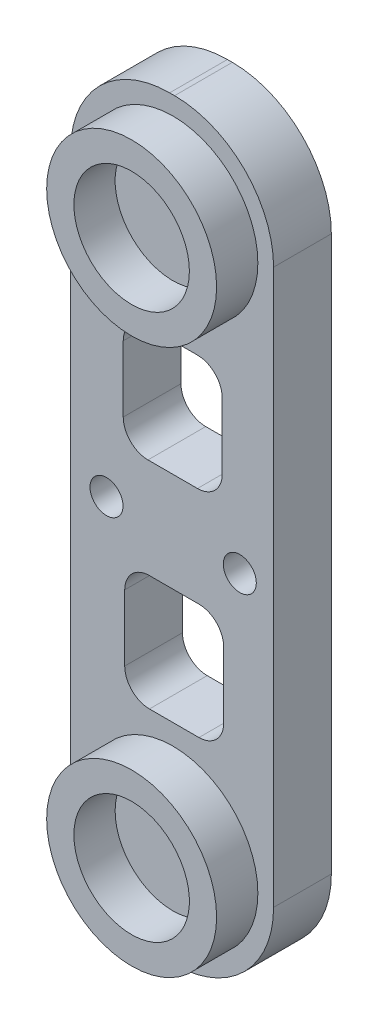
ISO-10303-21;
HEADER;
FILE_DESCRIPTION(('STEP AP214'),'2;1');
FILE_NAME('part.step','',(''),(''),'','','');
FILE_SCHEMA(('AUTOMOTIVE_DESIGN { 1 0 10303 214 1 1 1 1 }'));
ENDSEC;
DATA;
#1=APPLICATION_CONTEXT('core data for automotive mechanical design processes');
#2=APPLICATION_PROTOCOL_DEFINITION('international standard','automotive_design',2000,#1);
#3=PRODUCT_CONTEXT('',#1,'mechanical');
#4=PRODUCT('Part','Part','',(#3));
#5=PRODUCT_RELATED_PRODUCT_CATEGORY('part','',(#4));
#6=PRODUCT_DEFINITION_FORMATION('','',#4);
#7=PRODUCT_DEFINITION_CONTEXT('part definition',#1,'design');
#8=PRODUCT_DEFINITION('design','',#6,#7);
#9=PRODUCT_DEFINITION_SHAPE('','',#8);
#10=(LENGTH_UNIT() NAMED_UNIT(*) SI_UNIT(.MILLI.,.METRE.));
#11=(NAMED_UNIT(*) PLANE_ANGLE_UNIT() SI_UNIT($,.RADIAN.));
#12=(NAMED_UNIT(*) SI_UNIT($,.STERADIAN.) SOLID_ANGLE_UNIT());
#13=UNCERTAINTY_MEASURE_WITH_UNIT(LENGTH_MEASURE(1.E-05),#10,'distance_accuracy_value','');
#14=(GEOMETRIC_REPRESENTATION_CONTEXT(3) GLOBAL_UNCERTAINTY_ASSIGNED_CONTEXT((#13)) GLOBAL_UNIT_ASSIGNED_CONTEXT((#10,
#11,#12)) REPRESENTATION_CONTEXT('',''));
#15=CARTESIAN_POINT('',(0.,0.,0.));
#16=DIRECTION('',(0.,0.,1.));
#17=DIRECTION('',(1.,0.,0.));
#18=AXIS2_PLACEMENT_3D('',#15,#16,#17);
#19=CARTESIAN_POINT('',(0.,0.,13.5));
#20=DIRECTION('',(0.,0.,1.));
#21=DIRECTION('',(1.,0.,0.));
#22=AXIS2_PLACEMENT_3D('',#19,#20,#21);
#23=PLANE('',#22);
#24=CARTESIAN_POINT('',(-295.031286371623,300.589255580996,13.5));
#25=DIRECTION('',(0.,0.,1.));
#26=DIRECTION('',(-1.,0.,0.));
#27=AXIS2_PLACEMENT_3D('',#24,#25,#26);
#28=CIRCLE('',#27,5.15000000000001);
#29=CARTESIAN_POINT('',(-300.181286371623,300.589255580996,13.5));
#30=VERTEX_POINT('',#29);
#31=EDGE_CURVE('E673',#30,#30,#28,.T.);
#32=ORIENTED_EDGE('',*,*,#31,.F.);
#33=EDGE_LOOP('',(#32));
#34=FACE_BOUND('',#33,.T.);
#35=CARTESIAN_POINT('',(-295.031286371623,333.661108149607,13.5));
#36=DIRECTION('',(0.,0.,1.));
#37=DIRECTION('',(1.,0.,0.));
#38=AXIS2_PLACEMENT_3D('',#35,#36,#37);
#39=CIRCLE('',#38,5.15000000000001);
#40=CARTESIAN_POINT('',(-289.881286371623,333.661108149607,13.5));
#41=VERTEX_POINT('',#40);
#42=EDGE_CURVE('E661',#41,#41,#39,.T.);
#43=ORIENTED_EDGE('',*,*,#42,.F.);
#44=EDGE_LOOP('',(#43));
#45=FACE_BOUND('',#44,.T.);
#46=CARTESIAN_POINT('',(-290.975313949645,316.822329318234,13.5));
#47=DIRECTION('',(0.,0.,1.));
#48=DIRECTION('',(1.,0.,0.));
#49=AXIS2_PLACEMENT_3D('',#46,#47,#48);
#50=CIRCLE('',#49,0.999999999999998);
#51=CARTESIAN_POINT('',(-289.975313949645,316.822329318234,13.5));
#52=VERTEX_POINT('',#51);
#53=EDGE_CURVE('E480',#52,#52,#50,.T.);
#54=ORIENTED_EDGE('',*,*,#53,.F.);
#55=EDGE_LOOP('',(#54));
#56=FACE_BOUND('',#55,.T.);
#57=DIRECTION('',(0.,1.,0.));
#58=VECTOR('',#57,1.);
#59=CARTESIAN_POINT('',(-288.927990013679,339.925181865302,13.5));
#60=LINE('',#59,#58);
#61=CARTESIAN_POINT('',(-288.927990013679,300.325181865302,13.5));
#62=VERTEX_POINT('',#61);
#63=CARTESIAN_POINT('',(-288.927990013679,333.925181865302,13.5));
#64=VERTEX_POINT('',#63);
#65=EDGE_CURVE('E499',#62,#64,#60,.T.);
#66=ORIENTED_EDGE('',*,*,#65,.T.);
#67=CARTESIAN_POINT('',(-294.927990013679,333.925181865302,13.5));
#68=DIRECTION('',(0.,0.,1.));
#69=DIRECTION('',(1.,0.,0.));
#70=AXIS2_PLACEMENT_3D('',#67,#68,#69);
#71=CIRCLE('',#70,6.);
#72=CARTESIAN_POINT('',(-294.927990013679,339.925181865302,13.5));
#73=VERTEX_POINT('',#72);
#74=EDGE_CURVE('E268',#64,#73,#71,.T.);
#75=ORIENTED_EDGE('',*,*,#74,.T.);
#76=DIRECTION('',(-1.,0.,0.));
#77=VECTOR('',#76,1.);
#78=CARTESIAN_POINT('',(-301.227990013679,339.925181865302,13.5));
#79=LINE('',#78,#77);
#80=CARTESIAN_POINT('',(-295.227990013679,339.925181865302,13.5));
#81=VERTEX_POINT('',#80);
#82=EDGE_CURVE('E224',#73,#81,#79,.T.);
#83=ORIENTED_EDGE('',*,*,#82,.T.);
#84=CARTESIAN_POINT('',(-295.227990013679,333.925181865302,13.5));
#85=DIRECTION('',(0.,0.,1.));
#86=DIRECTION('',(1.,0.,0.));
#87=AXIS2_PLACEMENT_3D('',#84,#85,#86);
#88=CIRCLE('',#87,6.);
#89=CARTESIAN_POINT('',(-301.227990013679,333.925181865302,13.5));
#90=VERTEX_POINT('',#89);
#91=EDGE_CURVE('E265',#81,#90,#88,.T.);
#92=ORIENTED_EDGE('',*,*,#91,.T.);
#93=DIRECTION('',(0.,-1.,0.));
#94=VECTOR('',#93,1.);
#95=CARTESIAN_POINT('',(-301.227990013679,339.925181865302,13.5));
#96=LINE('',#95,#94);
#97=CARTESIAN_POINT('',(-301.227990013679,300.325181865302,13.5));
#98=VERTEX_POINT('',#97);
#99=EDGE_CURVE('E233',#90,#98,#96,.T.);
#100=ORIENTED_EDGE('',*,*,#99,.T.);
#101=CARTESIAN_POINT('',(-295.227990013679,300.325181865302,13.5));
#102=DIRECTION('',(0.,0.,1.));
#103=DIRECTION('',(1.,0.,0.));
#104=AXIS2_PLACEMENT_3D('',#101,#102,#103);
#105=CIRCLE('',#104,6.);
#106=CARTESIAN_POINT('',(-295.227990013679,294.325181865302,13.5));
#107=VERTEX_POINT('',#106);
#108=EDGE_CURVE('E259',#98,#107,#105,.T.);
#109=ORIENTED_EDGE('',*,*,#108,.T.);
#110=DIRECTION('',(1.,0.,0.));
#111=VECTOR('',#110,1.);
#112=CARTESIAN_POINT('',(-301.227990013679,294.325181865302,13.5));
#113=LINE('',#112,#111);
#114=CARTESIAN_POINT('',(-294.927990013679,294.325181865302,13.5));
#115=VERTEX_POINT('',#114);
#116=EDGE_CURVE('E239',#107,#115,#113,.T.);
#117=ORIENTED_EDGE('',*,*,#116,.T.);
#118=CARTESIAN_POINT('',(-294.927990013679,300.325181865302,13.5));
#119=DIRECTION('',(0.,0.,1.));
#120=DIRECTION('',(1.,0.,0.));
#121=AXIS2_PLACEMENT_3D('',#118,#119,#120);
#122=CIRCLE('',#121,6.);
#123=EDGE_CURVE('E262',#115,#62,#122,.T.);
#124=ORIENTED_EDGE('',*,*,#123,.T.);
#125=EDGE_LOOP('',(#66,#75,#83,#92,#100,#109,#117,#124));
#126=FACE_BOUND('',#125,.T.);
#127=CARTESIAN_POINT('',(-299.05350465197,316.822329318234,13.5));
#128=DIRECTION('',(0.,0.,1.));
#129=DIRECTION('',(1.,0.,0.));
#130=AXIS2_PLACEMENT_3D('',#127,#128,#129);
#131=CIRCLE('',#130,0.999999999999998);
#132=CARTESIAN_POINT('',(-298.05350465197,316.822329318234,13.5));
#133=VERTEX_POINT('',#132);
#134=EDGE_CURVE('E485',#133,#133,#131,.T.);
#135=ORIENTED_EDGE('',*,*,#134,.F.);
#136=EDGE_LOOP('',(#135));
#137=FACE_BOUND('',#136,.T.);
#138=DIRECTION('',(-1.,0.,0.));
#139=VECTOR('',#138,1.);
#140=CARTESIAN_POINT('',(-291.95137434347,313.976860406476,13.5));
#141=LINE('',#140,#139);
#142=CARTESIAN_POINT('',(-293.45137434347,313.976860406476,13.5));
#143=VERTEX_POINT('',#142);
#144=CARTESIAN_POINT('',(-296.451374343471,313.976860406476,13.5));
#145=VERTEX_POINT('',#144);
#146=EDGE_CURVE('E621',#143,#145,#141,.T.);
#147=ORIENTED_EDGE('',*,*,#146,.F.);
#148=CARTESIAN_POINT('',(-293.45137434347,312.476860406476,13.5));
#149=DIRECTION('',(0.,0.,1.));
#150=DIRECTION('',(1.,0.,0.));
#151=AXIS2_PLACEMENT_3D('',#148,#149,#150);
#152=CIRCLE('',#151,1.5);
#153=CARTESIAN_POINT('',(-291.95137434347,312.476860406476,13.5));
#154=VERTEX_POINT('',#153);
#155=EDGE_CURVE('E355',#143,#154,#152,.F.);
#156=ORIENTED_EDGE('',*,*,#155,.T.);
#157=DIRECTION('',(0.,1.,0.));
#158=VECTOR('',#157,1.);
#159=CARTESIAN_POINT('',(-291.95137434347,306.976860406476,13.5));
#160=LINE('',#159,#158);
#161=CARTESIAN_POINT('',(-291.95137434347,308.476860406476,13.5));
#162=VERTEX_POINT('',#161);
#163=EDGE_CURVE('E617',#162,#154,#160,.T.);
#164=ORIENTED_EDGE('',*,*,#163,.F.);
#165=CARTESIAN_POINT('',(-293.45137434347,308.476860406476,13.5));
#166=DIRECTION('',(0.,0.,1.));
#167=DIRECTION('',(1.,0.,0.));
#168=AXIS2_PLACEMENT_3D('',#165,#166,#167);
#169=CIRCLE('',#168,1.5);
#170=CARTESIAN_POINT('',(-293.45137434347,306.976860406476,13.5));
#171=VERTEX_POINT('',#170);
#172=EDGE_CURVE('E349',#162,#171,#169,.F.);
#173=ORIENTED_EDGE('',*,*,#172,.T.);
#174=DIRECTION('',(1.,0.,0.));
#175=VECTOR('',#174,1.);
#176=CARTESIAN_POINT('',(-291.95137434347,306.976860406476,13.5));
#177=LINE('',#176,#175);
#178=CARTESIAN_POINT('',(-296.451374343471,306.976860406476,13.5));
#179=VERTEX_POINT('',#178);
#180=EDGE_CURVE('E630',#179,#171,#177,.T.);
#181=ORIENTED_EDGE('',*,*,#180,.F.);
#182=CARTESIAN_POINT('',(-296.451374343471,308.476860406476,13.5));
#183=DIRECTION('',(0.,0.,1.));
#184=DIRECTION('',(1.,0.,0.));
#185=AXIS2_PLACEMENT_3D('',#182,#183,#184);
#186=CIRCLE('',#185,1.5);
#187=CARTESIAN_POINT('',(-297.951374343471,308.476860406476,13.5));
#188=VERTEX_POINT('',#187);
#189=EDGE_CURVE('E343',#179,#188,#186,.F.);
#190=ORIENTED_EDGE('',*,*,#189,.T.);
#191=DIRECTION('',(0.,-1.,0.));
#192=VECTOR('',#191,1.);
#193=CARTESIAN_POINT('',(-297.951374343471,306.976860406476,13.5));
#194=LINE('',#193,#192);
#195=CARTESIAN_POINT('',(-297.951374343471,312.476860406476,13.5));
#196=VERTEX_POINT('',#195);
#197=EDGE_CURVE('E626',#196,#188,#194,.T.);
#198=ORIENTED_EDGE('',*,*,#197,.F.);
#199=CARTESIAN_POINT('',(-296.451374343471,312.476860406476,13.5));
#200=DIRECTION('',(0.,0.,1.));
#201=DIRECTION('',(1.,0.,0.));
#202=AXIS2_PLACEMENT_3D('',#199,#200,#201);
#203=CIRCLE('',#202,1.5);
#204=EDGE_CURVE('E361',#196,#145,#203,.F.);
#205=ORIENTED_EDGE('',*,*,#204,.T.);
#206=EDGE_LOOP('',(#147,#156,#164,#173,#181,#190,#198,#205));
#207=FACE_BOUND('',#206,.T.);
#208=DIRECTION('',(-1.,0.,0.));
#209=VECTOR('',#208,1.);
#210=CARTESIAN_POINT('',(-292.040754441965,327.002825528129,13.5));
#211=LINE('',#210,#209);
#212=CARTESIAN_POINT('',(-293.540754441965,327.002825528129,13.5));
#213=VERTEX_POINT('',#212);
#214=CARTESIAN_POINT('',(-296.540754441965,327.002825528129,13.5));
#215=VERTEX_POINT('',#214);
#216=EDGE_CURVE('E590',#213,#215,#211,.T.);
#217=ORIENTED_EDGE('',*,*,#216,.F.);
#218=CARTESIAN_POINT('',(-293.540754441965,325.502825528129,13.5));
#219=DIRECTION('',(0.,0.,1.));
#220=DIRECTION('',(1.,0.,0.));
#221=AXIS2_PLACEMENT_3D('',#218,#219,#220);
#222=CIRCLE('',#221,1.5);
#223=CARTESIAN_POINT('',(-292.040754441965,325.502825528129,13.5));
#224=VERTEX_POINT('',#223);
#225=EDGE_CURVE('E55',#213,#224,#222,.F.);
#226=ORIENTED_EDGE('',*,*,#225,.T.);
#227=DIRECTION('',(0.,1.,0.));
#228=VECTOR('',#227,1.);
#229=CARTESIAN_POINT('',(-292.040754441965,320.002825528129,13.5));
#230=LINE('',#229,#228);
#231=CARTESIAN_POINT('',(-292.040754441965,321.502825528129,13.5));
#232=VERTEX_POINT('',#231);
#233=EDGE_CURVE('E597',#232,#224,#230,.T.);
#234=ORIENTED_EDGE('',*,*,#233,.F.);
#235=CARTESIAN_POINT('',(-293.540754441965,321.502825528129,13.5));
#236=DIRECTION('',(0.,0.,1.));
#237=DIRECTION('',(1.,0.,0.));
#238=AXIS2_PLACEMENT_3D('',#235,#236,#237);
#239=CIRCLE('',#238,1.5);
#240=CARTESIAN_POINT('',(-293.540754441965,320.002825528129,13.5));
#241=VERTEX_POINT('',#240);
#242=EDGE_CURVE('E373',#232,#241,#239,.F.);
#243=ORIENTED_EDGE('',*,*,#242,.T.);
#244=DIRECTION('',(1.,0.,0.));
#245=VECTOR('',#244,1.);
#246=CARTESIAN_POINT('',(-292.040754441965,320.002825528129,13.5));
#247=LINE('',#246,#245);
#248=CARTESIAN_POINT('',(-296.540754441965,320.002825528129,13.5));
#249=VERTEX_POINT('',#248);
#250=EDGE_CURVE('E585',#249,#241,#247,.T.);
#251=ORIENTED_EDGE('',*,*,#250,.F.);
#252=CARTESIAN_POINT('',(-296.540754441965,321.502825528129,13.5));
#253=DIRECTION('',(0.,0.,1.));
#254=DIRECTION('',(1.,0.,0.));
#255=AXIS2_PLACEMENT_3D('',#252,#253,#254);
#256=CIRCLE('',#255,1.5);
#257=CARTESIAN_POINT('',(-298.040754441965,321.502825528129,13.5));
#258=VERTEX_POINT('',#257);
#259=EDGE_CURVE('E379',#249,#258,#256,.F.);
#260=ORIENTED_EDGE('',*,*,#259,.T.);
#261=DIRECTION('',(0.,-1.,0.));
#262=VECTOR('',#261,1.);
#263=CARTESIAN_POINT('',(-298.040754441965,320.002825528129,13.5));
#264=LINE('',#263,#262);
#265=CARTESIAN_POINT('',(-298.040754441965,325.502825528129,13.5));
#266=VERTEX_POINT('',#265);
#267=EDGE_CURVE('E582',#266,#258,#264,.T.);
#268=ORIENTED_EDGE('',*,*,#267,.F.);
#269=CARTESIAN_POINT('',(-296.540754441965,325.502825528129,13.5));
#270=DIRECTION('',(0.,0.,1.));
#271=DIRECTION('',(1.,0.,0.));
#272=AXIS2_PLACEMENT_3D('',#269,#270,#271);
#273=CIRCLE('',#272,1.5);
#274=EDGE_CURVE('E367',#266,#215,#273,.F.);
#275=ORIENTED_EDGE('',*,*,#274,.T.);
#276=EDGE_LOOP('',(#217,#226,#234,#243,#251,#260,#268,#275));
#277=FACE_BOUND('',#276,.T.);
#278=ADVANCED_FACE('F39',(#34,#45,#56,#126,#137,#207,#277),#23,.T.);
#279=CARTESIAN_POINT('',(0.,0.,10.));
#280=DIRECTION('',(0.,0.,1.));
#281=DIRECTION('',(1.,0.,0.));
#282=AXIS2_PLACEMENT_3D('',#279,#280,#281);
#283=PLANE('',#282);
#284=DIRECTION('',(1.,0.,0.));
#285=VECTOR('',#284,1.);
#286=CARTESIAN_POINT('',(-291.95137434347,306.976860406476,10.));
#287=LINE('',#286,#285);
#288=CARTESIAN_POINT('',(-296.451374343471,306.976860406476,10.));
#289=VERTEX_POINT('',#288);
#290=CARTESIAN_POINT('',(-293.45137434347,306.976860406476,10.));
#291=VERTEX_POINT('',#290);
#292=EDGE_CURVE('E622',#289,#291,#287,.T.);
#293=ORIENTED_EDGE('',*,*,#292,.T.);
#294=CARTESIAN_POINT('',(-293.45137434347,308.476860406476,10.));
#295=DIRECTION('',(0.,0.,1.));
#296=DIRECTION('',(1.,0.,0.));
#297=AXIS2_PLACEMENT_3D('',#294,#295,#296);
#298=CIRCLE('',#297,1.5);
#299=CARTESIAN_POINT('',(-291.95137434347,308.476860406476,10.));
#300=VERTEX_POINT('',#299);
#301=EDGE_CURVE('E346',#291,#300,#298,.T.);
#302=ORIENTED_EDGE('',*,*,#301,.T.);
#303=DIRECTION('',(0.,1.,0.));
#304=VECTOR('',#303,1.);
#305=CARTESIAN_POINT('',(-291.95137434347,306.976860406476,10.));
#306=LINE('',#305,#304);
#307=CARTESIAN_POINT('',(-291.95137434347,312.476860406476,10.));
#308=VERTEX_POINT('',#307);
#309=EDGE_CURVE('E594',#300,#308,#306,.T.);
#310=ORIENTED_EDGE('',*,*,#309,.T.);
#311=CARTESIAN_POINT('',(-293.45137434347,312.476860406476,10.));
#312=DIRECTION('',(0.,0.,1.));
#313=DIRECTION('',(1.,0.,0.));
#314=AXIS2_PLACEMENT_3D('',#311,#312,#313);
#315=CIRCLE('',#314,1.5);
#316=CARTESIAN_POINT('',(-293.45137434347,313.976860406476,10.));
#317=VERTEX_POINT('',#316);
#318=EDGE_CURVE('E352',#308,#317,#315,.T.);
#319=ORIENTED_EDGE('',*,*,#318,.T.);
#320=DIRECTION('',(-1.,0.,0.));
#321=VECTOR('',#320,1.);
#322=CARTESIAN_POINT('',(-291.95137434347,313.976860406476,10.));
#323=LINE('',#322,#321);
#324=CARTESIAN_POINT('',(-296.451374343471,313.976860406476,10.));
#325=VERTEX_POINT('',#324);
#326=EDGE_CURVE('E637',#317,#325,#323,.T.);
#327=ORIENTED_EDGE('',*,*,#326,.T.);
#328=CARTESIAN_POINT('',(-296.451374343471,312.476860406476,10.));
#329=DIRECTION('',(0.,0.,1.));
#330=DIRECTION('',(1.,0.,0.));
#331=AXIS2_PLACEMENT_3D('',#328,#329,#330);
#332=CIRCLE('',#331,1.5);
#333=CARTESIAN_POINT('',(-297.951374343471,312.476860406476,10.));
#334=VERTEX_POINT('',#333);
#335=EDGE_CURVE('E358',#325,#334,#332,.T.);
#336=ORIENTED_EDGE('',*,*,#335,.T.);
#337=DIRECTION('',(0.,-1.,0.));
#338=VECTOR('',#337,1.);
#339=CARTESIAN_POINT('',(-297.951374343471,306.976860406476,10.));
#340=LINE('',#339,#338);
#341=CARTESIAN_POINT('',(-297.951374343471,308.476860406476,10.));
#342=VERTEX_POINT('',#341);
#343=EDGE_CURVE('E641',#334,#342,#340,.T.);
#344=ORIENTED_EDGE('',*,*,#343,.T.);
#345=CARTESIAN_POINT('',(-296.451374343471,308.476860406476,10.));
#346=DIRECTION('',(0.,0.,1.));
#347=DIRECTION('',(1.,0.,0.));
#348=AXIS2_PLACEMENT_3D('',#345,#346,#347);
#349=CIRCLE('',#348,1.5);
#350=EDGE_CURVE('E340',#342,#289,#349,.T.);
#351=ORIENTED_EDGE('',*,*,#350,.T.);
#352=EDGE_LOOP('',(#293,#302,#310,#319,#327,#336,#344,#351));
#353=FACE_BOUND('',#352,.T.);
#354=DIRECTION('',(-1.,0.,0.));
#355=VECTOR('',#354,1.);
#356=CARTESIAN_POINT('',(-301.227990013679,339.925181865302,10.));
#357=LINE('',#356,#355);
#358=CARTESIAN_POINT('',(-294.927990013679,339.925181865302,10.));
#359=VERTEX_POINT('',#358);
#360=CARTESIAN_POINT('',(-295.227990013679,339.925181865302,10.));
#361=VERTEX_POINT('',#360);
#362=EDGE_CURVE('E221',#359,#361,#357,.T.);
#363=ORIENTED_EDGE('',*,*,#362,.F.);
#364=CARTESIAN_POINT('',(-294.927990013679,333.925181865302,10.));
#365=DIRECTION('',(0.,0.,1.));
#366=DIRECTION('',(1.,0.,0.));
#367=AXIS2_PLACEMENT_3D('',#364,#365,#366);
#368=CIRCLE('',#367,6.);
#369=CARTESIAN_POINT('',(-288.927990013679,333.925181865302,10.));
#370=VERTEX_POINT('',#369);
#371=EDGE_CURVE('E203',#359,#370,#368,.F.);
#372=ORIENTED_EDGE('',*,*,#371,.T.);
#373=DIRECTION('',(0.,1.,0.));
#374=VECTOR('',#373,1.);
#375=CARTESIAN_POINT('',(-288.927990013679,339.925181865302,10.));
#376=LINE('',#375,#374);
#377=CARTESIAN_POINT('',(-288.927990013679,300.325181865302,10.));
#378=VERTEX_POINT('',#377);
#379=EDGE_CURVE('E234',#378,#370,#376,.T.);
#380=ORIENTED_EDGE('',*,*,#379,.F.);
#381=CARTESIAN_POINT('',(-294.927990013679,300.325181865302,10.));
#382=DIRECTION('',(0.,0.,1.));
#383=DIRECTION('',(1.,0.,0.));
#384=AXIS2_PLACEMENT_3D('',#381,#382,#383);
#385=CIRCLE('',#384,6.);
#386=CARTESIAN_POINT('',(-294.927990013679,294.325181865302,10.));
#387=VERTEX_POINT('',#386);
#388=EDGE_CURVE('E249',#378,#387,#385,.F.);
#389=ORIENTED_EDGE('',*,*,#388,.T.);
#390=DIRECTION('',(1.,0.,0.));
#391=VECTOR('',#390,1.);
#392=CARTESIAN_POINT('',(-301.227990013679,294.325181865302,10.));
#393=LINE('',#392,#391);
#394=CARTESIAN_POINT('',(-295.227990013679,294.325181865302,10.));
#395=VERTEX_POINT('',#394);
#396=EDGE_CURVE('E241',#395,#387,#393,.T.);
#397=ORIENTED_EDGE('',*,*,#396,.F.);
#398=CARTESIAN_POINT('',(-295.227990013679,300.325181865302,10.));
#399=DIRECTION('',(0.,0.,1.));
#400=DIRECTION('',(1.,0.,0.));
#401=AXIS2_PLACEMENT_3D('',#398,#399,#400);
#402=CIRCLE('',#401,6.);
#403=CARTESIAN_POINT('',(-301.227990013679,300.325181865302,10.));
#404=VERTEX_POINT('',#403);
#405=EDGE_CURVE('E226',#395,#404,#402,.F.);
#406=ORIENTED_EDGE('',*,*,#405,.T.);
#407=DIRECTION('',(0.,-1.,0.));
#408=VECTOR('',#407,1.);
#409=CARTESIAN_POINT('',(-301.227990013679,339.925181865302,10.));
#410=LINE('',#409,#408);
#411=CARTESIAN_POINT('',(-301.227990013679,333.925181865302,10.));
#412=VERTEX_POINT('',#411);
#413=EDGE_CURVE('E489',#412,#404,#410,.T.);
#414=ORIENTED_EDGE('',*,*,#413,.F.);
#415=CARTESIAN_POINT('',(-295.227990013679,333.925181865302,10.));
#416=DIRECTION('',(0.,0.,1.));
#417=DIRECTION('',(1.,0.,0.));
#418=AXIS2_PLACEMENT_3D('',#415,#416,#417);
#419=CIRCLE('',#418,6.);
#420=EDGE_CURVE('E215',#412,#361,#419,.F.);
#421=ORIENTED_EDGE('',*,*,#420,.T.);
#422=EDGE_LOOP('',(#363,#372,#380,#389,#397,#406,#414,#421));
#423=FACE_BOUND('',#422,.T.);
#424=CARTESIAN_POINT('',(-290.975313949645,316.822329318234,10.));
#425=DIRECTION('',(0.,0.,1.));
#426=DIRECTION('',(1.,0.,0.));
#427=AXIS2_PLACEMENT_3D('',#424,#425,#426);
#428=CIRCLE('',#427,0.999999999999998);
#429=CARTESIAN_POINT('',(-289.975313949645,316.822329318234,10.));
#430=VERTEX_POINT('',#429);
#431=EDGE_CURVE('E483',#430,#430,#428,.T.);
#432=ORIENTED_EDGE('',*,*,#431,.T.);
#433=EDGE_LOOP('',(#432));
#434=FACE_BOUND('',#433,.T.);
#435=CARTESIAN_POINT('',(-299.05350465197,316.822329318234,10.));
#436=DIRECTION('',(0.,0.,1.));
#437=DIRECTION('',(1.,0.,0.));
#438=AXIS2_PLACEMENT_3D('',#435,#436,#437);
#439=CIRCLE('',#438,0.999999999999998);
#440=CARTESIAN_POINT('',(-298.05350465197,316.822329318234,10.));
#441=VERTEX_POINT('',#440);
#442=EDGE_CURVE('E492',#441,#441,#439,.T.);
#443=ORIENTED_EDGE('',*,*,#442,.T.);
#444=EDGE_LOOP('',(#443));
#445=FACE_BOUND('',#444,.T.);
#446=DIRECTION('',(1.,0.,0.));
#447=VECTOR('',#446,1.);
#448=CARTESIAN_POINT('',(-292.040754441965,320.002825528129,10.));
#449=LINE('',#448,#447);
#450=CARTESIAN_POINT('',(-296.540754441965,320.002825528129,10.));
#451=VERTEX_POINT('',#450);
#452=CARTESIAN_POINT('',(-293.540754441965,320.002825528129,10.));
#453=VERTEX_POINT('',#452);
#454=EDGE_CURVE('E613',#451,#453,#449,.T.);
#455=ORIENTED_EDGE('',*,*,#454,.T.);
#456=CARTESIAN_POINT('',(-293.540754441965,321.502825528129,10.));
#457=DIRECTION('',(0.,0.,1.));
#458=DIRECTION('',(1.,0.,0.));
#459=AXIS2_PLACEMENT_3D('',#456,#457,#458);
#460=CIRCLE('',#459,1.5);
#461=CARTESIAN_POINT('',(-292.040754441965,321.502825528129,10.));
#462=VERTEX_POINT('',#461);
#463=EDGE_CURVE('E370',#453,#462,#460,.T.);
#464=ORIENTED_EDGE('',*,*,#463,.T.);
#465=DIRECTION('',(0.,1.,0.));
#466=VECTOR('',#465,1.);
#467=CARTESIAN_POINT('',(-292.040754441965,320.002825528129,10.));
#468=LINE('',#467,#466);
#469=CARTESIAN_POINT('',(-292.040754441965,325.502825528129,10.));
#470=VERTEX_POINT('',#469);
#471=EDGE_CURVE('E601',#462,#470,#468,.T.);
#472=ORIENTED_EDGE('',*,*,#471,.T.);
#473=CARTESIAN_POINT('',(-293.540754441965,325.502825528129,10.));
#474=DIRECTION('',(0.,0.,1.));
#475=DIRECTION('',(1.,0.,0.));
#476=AXIS2_PLACEMENT_3D('',#473,#474,#475);
#477=CIRCLE('',#476,1.5);
#478=CARTESIAN_POINT('',(-293.540754441965,327.002825528129,10.));
#479=VERTEX_POINT('',#478);
#480=EDGE_CURVE('E382',#470,#479,#477,.T.);
#481=ORIENTED_EDGE('',*,*,#480,.T.);
#482=DIRECTION('',(-1.,0.,0.));
#483=VECTOR('',#482,1.);
#484=CARTESIAN_POINT('',(-292.040754441965,327.002825528129,10.));
#485=LINE('',#484,#483);
#486=CARTESIAN_POINT('',(-296.540754441965,327.002825528129,10.));
#487=VERTEX_POINT('',#486);
#488=EDGE_CURVE('E605',#479,#487,#485,.T.);
#489=ORIENTED_EDGE('',*,*,#488,.T.);
#490=CARTESIAN_POINT('',(-296.540754441965,325.502825528129,10.));
#491=DIRECTION('',(0.,0.,1.));
#492=DIRECTION('',(1.,0.,0.));
#493=AXIS2_PLACEMENT_3D('',#490,#491,#492);
#494=CIRCLE('',#493,1.5);
#495=CARTESIAN_POINT('',(-298.040754441965,325.502825528129,10.));
#496=VERTEX_POINT('',#495);
#497=EDGE_CURVE('E364',#487,#496,#494,.T.);
#498=ORIENTED_EDGE('',*,*,#497,.T.);
#499=DIRECTION('',(0.,-1.,0.));
#500=VECTOR('',#499,1.);
#501=CARTESIAN_POINT('',(-298.040754441965,320.002825528129,10.));
#502=LINE('',#501,#500);
#503=CARTESIAN_POINT('',(-298.040754441965,321.502825528129,10.));
#504=VERTEX_POINT('',#503);
#505=EDGE_CURVE('E610',#496,#504,#502,.T.);
#506=ORIENTED_EDGE('',*,*,#505,.T.);
#507=CARTESIAN_POINT('',(-296.540754441965,321.502825528129,10.));
#508=DIRECTION('',(0.,0.,1.));
#509=DIRECTION('',(1.,0.,0.));
#510=AXIS2_PLACEMENT_3D('',#507,#508,#509);
#511=CIRCLE('',#510,1.5);
#512=EDGE_CURVE('E376',#504,#451,#511,.T.);
#513=ORIENTED_EDGE('',*,*,#512,.T.);
#514=EDGE_LOOP('',(#455,#464,#472,#481,#489,#498,#506,#513));
#515=FACE_BOUND('',#514,.T.);
#516=ADVANCED_FACE('F229',(#353,#423,#434,#445,#515),#283,.F.);
#517=CARTESIAN_POINT('',(-301.227990013679,339.925181865302,13.5));
#518=DIRECTION('',(1.,0.,0.));
#519=DIRECTION('',(0.,0.,-1.));
#520=AXIS2_PLACEMENT_3D('',#517,#518,#519);
#521=PLANE('',#520);
#522=ORIENTED_EDGE('',*,*,#99,.F.);
#523=DIRECTION('',(0.,0.,-1.));
#524=VECTOR('',#523,1.);
#525=CARTESIAN_POINT('',(-301.227990013679,333.925181865302,13.5));
#526=LINE('',#525,#524);
#527=EDGE_CURVE('E274',#90,#412,#526,.T.);
#528=ORIENTED_EDGE('',*,*,#527,.T.);
#529=ORIENTED_EDGE('',*,*,#413,.T.);
#530=DIRECTION('',(0.,0.,-1.));
#531=VECTOR('',#530,1.);
#532=CARTESIAN_POINT('',(-301.227990013679,300.325181865302,13.5));
#533=LINE('',#532,#531);
#534=EDGE_CURVE('E271',#404,#98,#533,.F.);
#535=ORIENTED_EDGE('',*,*,#534,.T.);
#536=EDGE_LOOP('',(#522,#528,#529,#535));
#537=FACE_BOUND('',#536,.T.);
#538=ADVANCED_FACE('F528',(#537),#521,.F.);
#539=CARTESIAN_POINT('',(-301.227990013679,294.325181865302,13.5));
#540=DIRECTION('',(0.,1.,0.));
#541=DIRECTION('',(0.,0.,1.));
#542=AXIS2_PLACEMENT_3D('',#539,#540,#541);
#543=PLANE('',#542);
#544=ORIENTED_EDGE('',*,*,#396,.T.);
#545=DIRECTION('',(0.,0.,-1.));
#546=VECTOR('',#545,1.);
#547=CARTESIAN_POINT('',(-294.927990013679,294.325181865302,13.5));
#548=LINE('',#547,#546);
#549=EDGE_CURVE('E282',#387,#115,#548,.F.);
#550=ORIENTED_EDGE('',*,*,#549,.T.);
#551=ORIENTED_EDGE('',*,*,#116,.F.);
#552=DIRECTION('',(0.,0.,-1.));
#553=VECTOR('',#552,1.);
#554=CARTESIAN_POINT('',(-295.227990013679,294.325181865302,13.5));
#555=LINE('',#554,#553);
#556=EDGE_CURVE('E278',#107,#395,#555,.T.);
#557=ORIENTED_EDGE('',*,*,#556,.T.);
#558=EDGE_LOOP('',(#544,#550,#551,#557));
#559=FACE_BOUND('',#558,.T.);
#560=ADVANCED_FACE('F512',(#559),#543,.F.);
#561=CARTESIAN_POINT('',(-288.927990013679,339.925181865302,13.5));
#562=DIRECTION('',(-1.,0.,0.));
#563=DIRECTION('',(0.,-1.,0.));
#564=AXIS2_PLACEMENT_3D('',#561,#562,#563);
#565=PLANE('',#564);
#566=ORIENTED_EDGE('',*,*,#379,.T.);
#567=DIRECTION('',(0.,0.,-1.));
#568=VECTOR('',#567,1.);
#569=CARTESIAN_POINT('',(-288.927990013679,333.925181865302,13.5));
#570=LINE('',#569,#568);
#571=EDGE_CURVE('E208',#370,#64,#570,.F.);
#572=ORIENTED_EDGE('',*,*,#571,.T.);
#573=ORIENTED_EDGE('',*,*,#65,.F.);
#574=DIRECTION('',(0.,0.,-1.));
#575=VECTOR('',#574,1.);
#576=CARTESIAN_POINT('',(-288.927990013679,300.325181865302,13.5));
#577=LINE('',#576,#575);
#578=EDGE_CURVE('E214',#62,#378,#577,.T.);
#579=ORIENTED_EDGE('',*,*,#578,.T.);
#580=EDGE_LOOP('',(#566,#572,#573,#579));
#581=FACE_BOUND('',#580,.T.);
#582=ADVANCED_FACE('F475',(#581),#565,.F.);
#583=CARTESIAN_POINT('',(-301.227990013679,339.925181865302,13.5));
#584=DIRECTION('',(0.,-1.,0.));
#585=DIRECTION('',(1.,0.,0.));
#586=AXIS2_PLACEMENT_3D('',#583,#584,#585);
#587=PLANE('',#586);
#588=ORIENTED_EDGE('',*,*,#82,.F.);
#589=DIRECTION('',(0.,0.,-1.));
#590=VECTOR('',#589,1.);
#591=CARTESIAN_POINT('',(-294.927990013679,339.925181865302,13.5));
#592=LINE('',#591,#590);
#593=EDGE_CURVE('E207',#73,#359,#592,.T.);
#594=ORIENTED_EDGE('',*,*,#593,.T.);
#595=ORIENTED_EDGE('',*,*,#362,.T.);
#596=DIRECTION('',(0.,0.,-1.));
#597=VECTOR('',#596,1.);
#598=CARTESIAN_POINT('',(-295.227990013679,339.925181865302,13.5));
#599=LINE('',#598,#597);
#600=EDGE_CURVE('E227',#361,#81,#599,.F.);
#601=ORIENTED_EDGE('',*,*,#600,.T.);
#602=EDGE_LOOP('',(#588,#594,#595,#601));
#603=FACE_BOUND('',#602,.T.);
#604=ADVANCED_FACE('F220',(#603),#587,.F.);
#605=CARTESIAN_POINT('',(-290.975313949645,316.822329318234,13.5));
#606=DIRECTION('',(0.,0.,-1.));
#607=DIRECTION('',(-1.,0.,0.));
#608=AXIS2_PLACEMENT_3D('',#605,#606,#607);
#609=CYLINDRICAL_SURFACE('',#608,0.999999999999998);
#610=ORIENTED_EDGE('',*,*,#53,.T.);
#611=EDGE_LOOP('',(#610));
#612=FACE_BOUND('',#611,.T.);
#613=ORIENTED_EDGE('',*,*,#431,.F.);
#614=EDGE_LOOP('',(#613));
#615=FACE_BOUND('',#614,.T.);
#616=ADVANCED_FACE('F468',(#612,#615),#609,.F.);
#617=CARTESIAN_POINT('',(-299.05350465197,316.822329318234,13.5));
#618=DIRECTION('',(0.,0.,-1.));
#619=DIRECTION('',(-1.,0.,0.));
#620=AXIS2_PLACEMENT_3D('',#617,#618,#619);
#621=CYLINDRICAL_SURFACE('',#620,0.999999999999998);
#622=ORIENTED_EDGE('',*,*,#134,.T.);
#623=EDGE_LOOP('',(#622));
#624=FACE_BOUND('',#623,.T.);
#625=ORIENTED_EDGE('',*,*,#442,.F.);
#626=EDGE_LOOP('',(#625));
#627=FACE_BOUND('',#626,.T.);
#628=ADVANCED_FACE('F465',(#624,#627),#621,.F.);
#629=CARTESIAN_POINT('',(-291.95137434347,306.976860406476,13.5));
#630=DIRECTION('',(-1.,0.,0.));
#631=DIRECTION('',(0.,0.,1.));
#632=AXIS2_PLACEMENT_3D('',#629,#630,#631);
#633=PLANE('',#632);
#634=ORIENTED_EDGE('',*,*,#309,.F.);
#635=DIRECTION('',(0.,0.,-1.));
#636=VECTOR('',#635,1.);
#637=CARTESIAN_POINT('',(-291.95137434347,308.476860406476,13.5));
#638=LINE('',#637,#636);
#639=EDGE_CURVE('E303',#300,#162,#638,.F.);
#640=ORIENTED_EDGE('',*,*,#639,.T.);
#641=ORIENTED_EDGE('',*,*,#163,.T.);
#642=DIRECTION('',(0.,0.,-1.));
#643=VECTOR('',#642,1.);
#644=CARTESIAN_POINT('',(-291.95137434347,312.476860406476,10.));
#645=LINE('',#644,#643);
#646=EDGE_CURVE('E299',#154,#308,#645,.T.);
#647=ORIENTED_EDGE('',*,*,#646,.T.);
#648=EDGE_LOOP('',(#634,#640,#641,#647));
#649=FACE_BOUND('',#648,.T.);
#650=ADVANCED_FACE('F461',(#649),#633,.T.);
#651=CARTESIAN_POINT('',(-291.95137434347,313.976860406476,13.5));
#652=DIRECTION('',(0.,-1.,0.));
#653=DIRECTION('',(0.,0.,-1.));
#654=AXIS2_PLACEMENT_3D('',#651,#652,#653);
#655=PLANE('',#654);
#656=ORIENTED_EDGE('',*,*,#326,.F.);
#657=DIRECTION('',(0.,0.,-1.));
#658=VECTOR('',#657,1.);
#659=CARTESIAN_POINT('',(-293.45137434347,313.976860406476,13.5));
#660=LINE('',#659,#658);
#661=EDGE_CURVE('E310',#317,#143,#660,.F.);
#662=ORIENTED_EDGE('',*,*,#661,.T.);
#663=ORIENTED_EDGE('',*,*,#146,.T.);
#664=DIRECTION('',(0.,0.,-1.));
#665=VECTOR('',#664,1.);
#666=CARTESIAN_POINT('',(-296.451374343471,313.976860406476,10.));
#667=LINE('',#666,#665);
#668=EDGE_CURVE('E306',#145,#325,#667,.T.);
#669=ORIENTED_EDGE('',*,*,#668,.T.);
#670=EDGE_LOOP('',(#656,#662,#663,#669));
#671=FACE_BOUND('',#670,.T.);
#672=ADVANCED_FACE('F457',(#671),#655,.T.);
#673=CARTESIAN_POINT('',(-297.951374343471,306.976860406476,13.5));
#674=DIRECTION('',(1.,0.,0.));
#675=DIRECTION('',(0.,1.,0.));
#676=AXIS2_PLACEMENT_3D('',#673,#674,#675);
#677=PLANE('',#676);
#678=ORIENTED_EDGE('',*,*,#197,.T.);
#679=DIRECTION('',(0.,0.,-1.));
#680=VECTOR('',#679,1.);
#681=CARTESIAN_POINT('',(-297.951374343471,308.476860406476,10.));
#682=LINE('',#681,#680);
#683=EDGE_CURVE('E288',#188,#342,#682,.T.);
#684=ORIENTED_EDGE('',*,*,#683,.T.);
#685=ORIENTED_EDGE('',*,*,#343,.F.);
#686=DIRECTION('',(0.,0.,-1.));
#687=VECTOR('',#686,1.);
#688=CARTESIAN_POINT('',(-297.951374343471,312.476860406476,13.5));
#689=LINE('',#688,#687);
#690=EDGE_CURVE('E285',#334,#196,#689,.F.);
#691=ORIENTED_EDGE('',*,*,#690,.T.);
#692=EDGE_LOOP('',(#678,#684,#685,#691));
#693=FACE_BOUND('',#692,.T.);
#694=ADVANCED_FACE('F453',(#693),#677,.T.);
#695=CARTESIAN_POINT('',(-291.95137434347,306.976860406476,13.5));
#696=DIRECTION('',(0.,1.,0.));
#697=DIRECTION('',(0.,0.,1.));
#698=AXIS2_PLACEMENT_3D('',#695,#696,#697);
#699=PLANE('',#698);
#700=ORIENTED_EDGE('',*,*,#292,.F.);
#701=DIRECTION('',(0.,0.,-1.));
#702=VECTOR('',#701,1.);
#703=CARTESIAN_POINT('',(-296.451374343471,306.976860406476,13.5));
#704=LINE('',#703,#702);
#705=EDGE_CURVE('E296',#289,#179,#704,.F.);
#706=ORIENTED_EDGE('',*,*,#705,.T.);
#707=ORIENTED_EDGE('',*,*,#180,.T.);
#708=DIRECTION('',(0.,0.,-1.));
#709=VECTOR('',#708,1.);
#710=CARTESIAN_POINT('',(-293.45137434347,306.976860406476,10.));
#711=LINE('',#710,#709);
#712=EDGE_CURVE('E292',#171,#291,#711,.T.);
#713=ORIENTED_EDGE('',*,*,#712,.T.);
#714=EDGE_LOOP('',(#700,#706,#707,#713));
#715=FACE_BOUND('',#714,.T.);
#716=ADVANCED_FACE('F450',(#715),#699,.T.);
#717=CARTESIAN_POINT('',(-292.040754441965,320.002825528129,13.5));
#718=DIRECTION('',(-1.,0.,0.));
#719=DIRECTION('',(0.,0.,1.));
#720=AXIS2_PLACEMENT_3D('',#717,#718,#719);
#721=PLANE('',#720);
#722=ORIENTED_EDGE('',*,*,#471,.F.);
#723=DIRECTION('',(0.,0.,-1.));
#724=VECTOR('',#723,1.);
#725=CARTESIAN_POINT('',(-292.040754441965,321.502825528129,13.5));
#726=LINE('',#725,#724);
#727=EDGE_CURVE('E62',#462,#232,#726,.F.);
#728=ORIENTED_EDGE('',*,*,#727,.T.);
#729=ORIENTED_EDGE('',*,*,#233,.T.);
#730=DIRECTION('',(0.,0.,-1.));
#731=VECTOR('',#730,1.);
#732=CARTESIAN_POINT('',(-292.040754441965,325.502825528129,10.));
#733=LINE('',#732,#731);
#734=EDGE_CURVE('E334',#224,#470,#733,.T.);
#735=ORIENTED_EDGE('',*,*,#734,.T.);
#736=EDGE_LOOP('',(#722,#728,#729,#735));
#737=FACE_BOUND('',#736,.T.);
#738=ADVANCED_FACE('F446',(#737),#721,.T.);
#739=CARTESIAN_POINT('',(-292.040754441965,327.002825528129,13.5));
#740=DIRECTION('',(0.,-1.,0.));
#741=DIRECTION('',(0.,0.,-1.));
#742=AXIS2_PLACEMENT_3D('',#739,#740,#741);
#743=PLANE('',#742);
#744=ORIENTED_EDGE('',*,*,#216,.T.);
#745=DIRECTION('',(0.,0.,-1.));
#746=VECTOR('',#745,1.);
#747=CARTESIAN_POINT('',(-296.540754441965,327.002825528129,10.));
#748=LINE('',#747,#746);
#749=EDGE_CURVE('E316',#215,#487,#748,.T.);
#750=ORIENTED_EDGE('',*,*,#749,.T.);
#751=ORIENTED_EDGE('',*,*,#488,.F.);
#752=DIRECTION('',(0.,0.,-1.));
#753=VECTOR('',#752,1.);
#754=CARTESIAN_POINT('',(-293.540754441965,327.002825528129,13.5));
#755=LINE('',#754,#753);
#756=EDGE_CURVE('E313',#479,#213,#755,.F.);
#757=ORIENTED_EDGE('',*,*,#756,.T.);
#758=EDGE_LOOP('',(#744,#750,#751,#757));
#759=FACE_BOUND('',#758,.T.);
#760=ADVANCED_FACE('F442',(#759),#743,.T.);
#761=CARTESIAN_POINT('',(-298.040754441965,320.002825528129,13.5));
#762=DIRECTION('',(1.,0.,0.));
#763=DIRECTION('',(0.,0.,-1.));
#764=AXIS2_PLACEMENT_3D('',#761,#762,#763);
#765=PLANE('',#764);
#766=ORIENTED_EDGE('',*,*,#505,.F.);
#767=DIRECTION('',(0.,0.,-1.));
#768=VECTOR('',#767,1.);
#769=CARTESIAN_POINT('',(-298.040754441965,325.502825528129,13.5));
#770=LINE('',#769,#768);
#771=EDGE_CURVE('E324',#496,#266,#770,.F.);
#772=ORIENTED_EDGE('',*,*,#771,.T.);
#773=ORIENTED_EDGE('',*,*,#267,.T.);
#774=DIRECTION('',(0.,0.,-1.));
#775=VECTOR('',#774,1.);
#776=CARTESIAN_POINT('',(-298.040754441965,321.502825528129,10.));
#777=LINE('',#776,#775);
#778=EDGE_CURVE('E320',#258,#504,#777,.T.);
#779=ORIENTED_EDGE('',*,*,#778,.T.);
#780=EDGE_LOOP('',(#766,#772,#773,#779));
#781=FACE_BOUND('',#780,.T.);
#782=ADVANCED_FACE('F438',(#781),#765,.T.);
#783=CARTESIAN_POINT('',(-292.040754441965,320.002825528129,13.5));
#784=DIRECTION('',(0.,1.,0.));
#785=DIRECTION('',(0.,0.,1.));
#786=AXIS2_PLACEMENT_3D('',#783,#784,#785);
#787=PLANE('',#786);
#788=ORIENTED_EDGE('',*,*,#250,.T.);
#789=DIRECTION('',(0.,0.,-1.));
#790=VECTOR('',#789,1.);
#791=CARTESIAN_POINT('',(-293.540754441965,320.002825528129,10.));
#792=LINE('',#791,#790);
#793=EDGE_CURVE('E330',#241,#453,#792,.T.);
#794=ORIENTED_EDGE('',*,*,#793,.T.);
#795=ORIENTED_EDGE('',*,*,#454,.F.);
#796=DIRECTION('',(0.,0.,-1.));
#797=VECTOR('',#796,1.);
#798=CARTESIAN_POINT('',(-296.540754441965,320.002825528129,13.5));
#799=LINE('',#798,#797);
#800=EDGE_CURVE('E327',#451,#249,#799,.F.);
#801=ORIENTED_EDGE('',*,*,#800,.T.);
#802=EDGE_LOOP('',(#788,#794,#795,#801));
#803=FACE_BOUND('',#802,.T.);
#804=ADVANCED_FACE('F435',(#803),#787,.T.);
#805=CARTESIAN_POINT('',(-294.927990013679,333.925181865302,13.5));
#806=DIRECTION('',(0.,0.,-1.));
#807=DIRECTION('',(-1.,0.,0.));
#808=AXIS2_PLACEMENT_3D('',#805,#806,#807);
#809=CYLINDRICAL_SURFACE('',#808,6.);
#810=ORIENTED_EDGE('',*,*,#74,.F.);
#811=ORIENTED_EDGE('',*,*,#571,.F.);
#812=ORIENTED_EDGE('',*,*,#371,.F.);
#813=ORIENTED_EDGE('',*,*,#593,.F.);
#814=EDGE_LOOP('',(#810,#811,#812,#813));
#815=FACE_BOUND('',#814,.T.);
#816=ADVANCED_FACE('F206',(#815),#809,.T.);
#817=CARTESIAN_POINT('',(-295.227990013679,333.925181865302,13.5));
#818=DIRECTION('',(0.,0.,-1.));
#819=DIRECTION('',(-1.,0.,0.));
#820=AXIS2_PLACEMENT_3D('',#817,#818,#819);
#821=CYLINDRICAL_SURFACE('',#820,6.);
#822=ORIENTED_EDGE('',*,*,#91,.F.);
#823=ORIENTED_EDGE('',*,*,#600,.F.);
#824=ORIENTED_EDGE('',*,*,#420,.F.);
#825=ORIENTED_EDGE('',*,*,#527,.F.);
#826=EDGE_LOOP('',(#822,#823,#824,#825));
#827=FACE_BOUND('',#826,.T.);
#828=ADVANCED_FACE('F536',(#827),#821,.T.);
#829=CARTESIAN_POINT('',(-294.927990013679,300.325181865302,13.5));
#830=DIRECTION('',(0.,0.,-1.));
#831=DIRECTION('',(-1.,0.,0.));
#832=AXIS2_PLACEMENT_3D('',#829,#830,#831);
#833=CYLINDRICAL_SURFACE('',#832,6.);
#834=ORIENTED_EDGE('',*,*,#123,.F.);
#835=ORIENTED_EDGE('',*,*,#549,.F.);
#836=ORIENTED_EDGE('',*,*,#388,.F.);
#837=ORIENTED_EDGE('',*,*,#578,.F.);
#838=EDGE_LOOP('',(#834,#835,#836,#837));
#839=FACE_BOUND('',#838,.T.);
#840=ADVANCED_FACE('F517',(#839),#833,.T.);
#841=CARTESIAN_POINT('',(-295.227990013679,300.325181865302,13.5));
#842=DIRECTION('',(0.,0.,-1.));
#843=DIRECTION('',(-1.,0.,0.));
#844=AXIS2_PLACEMENT_3D('',#841,#842,#843);
#845=CYLINDRICAL_SURFACE('',#844,6.);
#846=ORIENTED_EDGE('',*,*,#108,.F.);
#847=ORIENTED_EDGE('',*,*,#534,.F.);
#848=ORIENTED_EDGE('',*,*,#405,.F.);
#849=ORIENTED_EDGE('',*,*,#556,.F.);
#850=EDGE_LOOP('',(#846,#847,#848,#849));
#851=FACE_BOUND('',#850,.T.);
#852=ADVANCED_FACE('F542',(#851),#845,.T.);
#853=CARTESIAN_POINT('',(-296.451374343471,308.476860406476,13.5));
#854=DIRECTION('',(0.,0.,1.));
#855=DIRECTION('',(1.,0.,0.));
#856=AXIS2_PLACEMENT_3D('',#853,#854,#855);
#857=CYLINDRICAL_SURFACE('',#856,1.5);
#858=ORIENTED_EDGE('',*,*,#189,.F.);
#859=ORIENTED_EDGE('',*,*,#705,.F.);
#860=ORIENTED_EDGE('',*,*,#350,.F.);
#861=ORIENTED_EDGE('',*,*,#683,.F.);
#862=EDGE_LOOP('',(#858,#859,#860,#861));
#863=FACE_BOUND('',#862,.T.);
#864=ADVANCED_FACE('F545',(#863),#857,.F.);
#865=CARTESIAN_POINT('',(-293.45137434347,308.476860406476,13.5));
#866=DIRECTION('',(0.,0.,1.));
#867=DIRECTION('',(1.,0.,0.));
#868=AXIS2_PLACEMENT_3D('',#865,#866,#867);
#869=CYLINDRICAL_SURFACE('',#868,1.5);
#870=ORIENTED_EDGE('',*,*,#172,.F.);
#871=ORIENTED_EDGE('',*,*,#639,.F.);
#872=ORIENTED_EDGE('',*,*,#301,.F.);
#873=ORIENTED_EDGE('',*,*,#712,.F.);
#874=EDGE_LOOP('',(#870,#871,#872,#873));
#875=FACE_BOUND('',#874,.T.);
#876=ADVANCED_FACE('F549',(#875),#869,.F.);
#877=CARTESIAN_POINT('',(-293.45137434347,312.476860406476,13.5));
#878=DIRECTION('',(0.,0.,1.));
#879=DIRECTION('',(1.,0.,0.));
#880=AXIS2_PLACEMENT_3D('',#877,#878,#879);
#881=CYLINDRICAL_SURFACE('',#880,1.5);
#882=ORIENTED_EDGE('',*,*,#155,.F.);
#883=ORIENTED_EDGE('',*,*,#661,.F.);
#884=ORIENTED_EDGE('',*,*,#318,.F.);
#885=ORIENTED_EDGE('',*,*,#646,.F.);
#886=EDGE_LOOP('',(#882,#883,#884,#885));
#887=FACE_BOUND('',#886,.T.);
#888=ADVANCED_FACE('F553',(#887),#881,.F.);
#889=CARTESIAN_POINT('',(-296.451374343471,312.476860406476,13.5));
#890=DIRECTION('',(0.,0.,1.));
#891=DIRECTION('',(1.,0.,0.));
#892=AXIS2_PLACEMENT_3D('',#889,#890,#891);
#893=CYLINDRICAL_SURFACE('',#892,1.5);
#894=ORIENTED_EDGE('',*,*,#204,.F.);
#895=ORIENTED_EDGE('',*,*,#690,.F.);
#896=ORIENTED_EDGE('',*,*,#335,.F.);
#897=ORIENTED_EDGE('',*,*,#668,.F.);
#898=EDGE_LOOP('',(#894,#895,#896,#897));
#899=FACE_BOUND('',#898,.T.);
#900=ADVANCED_FACE('F557',(#899),#893,.F.);
#901=CARTESIAN_POINT('',(-296.540754441965,325.502825528129,13.5));
#902=DIRECTION('',(0.,0.,1.));
#903=DIRECTION('',(1.,0.,0.));
#904=AXIS2_PLACEMENT_3D('',#901,#902,#903);
#905=CYLINDRICAL_SURFACE('',#904,1.5);
#906=ORIENTED_EDGE('',*,*,#274,.F.);
#907=ORIENTED_EDGE('',*,*,#771,.F.);
#908=ORIENTED_EDGE('',*,*,#497,.F.);
#909=ORIENTED_EDGE('',*,*,#749,.F.);
#910=EDGE_LOOP('',(#906,#907,#908,#909));
#911=FACE_BOUND('',#910,.T.);
#912=ADVANCED_FACE('F561',(#911),#905,.F.);
#913=CARTESIAN_POINT('',(-293.540754441965,321.502825528129,13.5));
#914=DIRECTION('',(0.,0.,1.));
#915=DIRECTION('',(1.,0.,0.));
#916=AXIS2_PLACEMENT_3D('',#913,#914,#915);
#917=CYLINDRICAL_SURFACE('',#916,1.5);
#918=ORIENTED_EDGE('',*,*,#242,.F.);
#919=ORIENTED_EDGE('',*,*,#727,.F.);
#920=ORIENTED_EDGE('',*,*,#463,.F.);
#921=ORIENTED_EDGE('',*,*,#793,.F.);
#922=EDGE_LOOP('',(#918,#919,#920,#921));
#923=FACE_BOUND('',#922,.T.);
#924=ADVANCED_FACE('F565',(#923),#917,.F.);
#925=CARTESIAN_POINT('',(-296.540754441965,321.502825528129,13.5));
#926=DIRECTION('',(0.,0.,1.));
#927=DIRECTION('',(1.,0.,0.));
#928=AXIS2_PLACEMENT_3D('',#925,#926,#927);
#929=CYLINDRICAL_SURFACE('',#928,1.5);
#930=ORIENTED_EDGE('',*,*,#259,.F.);
#931=ORIENTED_EDGE('',*,*,#800,.F.);
#932=ORIENTED_EDGE('',*,*,#512,.F.);
#933=ORIENTED_EDGE('',*,*,#778,.F.);
#934=EDGE_LOOP('',(#930,#931,#932,#933));
#935=FACE_BOUND('',#934,.T.);
#936=ADVANCED_FACE('F568',(#935),#929,.F.);
#937=CARTESIAN_POINT('',(-293.540754441965,325.502825528129,13.5));
#938=DIRECTION('',(0.,0.,1.));
#939=DIRECTION('',(1.,0.,0.));
#940=AXIS2_PLACEMENT_3D('',#937,#938,#939);
#941=CYLINDRICAL_SURFACE('',#940,1.5);
#942=ORIENTED_EDGE('',*,*,#225,.F.);
#943=ORIENTED_EDGE('',*,*,#756,.F.);
#944=ORIENTED_EDGE('',*,*,#480,.F.);
#945=ORIENTED_EDGE('',*,*,#734,.F.);
#946=EDGE_LOOP('',(#942,#943,#944,#945));
#947=FACE_BOUND('',#946,.T.);
#948=ADVANCED_FACE('F41',(#947),#941,.F.);
#949=CARTESIAN_POINT('',(-295.031286371623,333.661108149607,16.));
#950=DIRECTION('',(0.,0.,1.));
#951=DIRECTION('',(1.,0.,0.));
#952=AXIS2_PLACEMENT_3D('',#949,#950,#951);
#953=PLANE('',#952);
#954=CARTESIAN_POINT('',(-295.031286371623,333.661108149607,16.));
#955=DIRECTION('',(0.,0.,1.));
#956=DIRECTION('',(1.,0.,0.));
#957=AXIS2_PLACEMENT_3D('',#954,#955,#956);
#958=CIRCLE('',#957,5.15000000000001);
#959=CARTESIAN_POINT('',(-289.881286371623,333.661108149607,16.));
#960=VERTEX_POINT('',#959);
#961=EDGE_CURVE('E606',#960,#960,#958,.T.);
#962=ORIENTED_EDGE('',*,*,#961,.T.);
#963=EDGE_LOOP('',(#962));
#964=FACE_BOUND('',#963,.T.);
#965=CARTESIAN_POINT('',(-295.031286371623,333.661108149607,16.));
#966=DIRECTION('',(0.,0.,1.));
#967=DIRECTION('',(1.,0.,0.));
#968=AXIS2_PLACEMENT_3D('',#965,#966,#967);
#969=CIRCLE('',#968,3.49999999999997);
#970=CARTESIAN_POINT('',(-291.531286371623,333.661108149607,16.));
#971=VERTEX_POINT('',#970);
#972=EDGE_CURVE('E665',#971,#971,#969,.T.);
#973=ORIENTED_EDGE('',*,*,#972,.F.);
#974=EDGE_LOOP('',(#973));
#975=FACE_BOUND('',#974,.T.);
#976=ADVANCED_FACE('F428',(#964,#975),#953,.T.);
#977=CARTESIAN_POINT('',(-295.031286371623,333.661108149607,16.));
#978=DIRECTION('',(0.,0.,-1.));
#979=DIRECTION('',(-1.,0.,0.));
#980=AXIS2_PLACEMENT_3D('',#977,#978,#979);
#981=CYLINDRICAL_SURFACE('',#980,5.15000000000001);
#982=ORIENTED_EDGE('',*,*,#961,.F.);
#983=EDGE_LOOP('',(#982));
#984=FACE_BOUND('',#983,.T.);
#985=ORIENTED_EDGE('',*,*,#42,.T.);
#986=EDGE_LOOP('',(#985));
#987=FACE_BOUND('',#986,.T.);
#988=ADVANCED_FACE('F404',(#984,#987),#981,.T.);
#989=CARTESIAN_POINT('',(-295.031286371623,333.661108149607,16.));
#990=DIRECTION('',(0.,0.,-1.));
#991=DIRECTION('',(-1.,0.,0.));
#992=AXIS2_PLACEMENT_3D('',#989,#990,#991);
#993=CYLINDRICAL_SURFACE('',#992,3.49999999999997);
#994=ORIENTED_EDGE('',*,*,#972,.T.);
#995=EDGE_LOOP('',(#994));
#996=FACE_BOUND('',#995,.T.);
#997=CARTESIAN_POINT('',(-295.031286371623,333.661108149607,13.5));
#998=DIRECTION('',(0.,0.,1.));
#999=DIRECTION('',(1.,0.,0.));
#1000=AXIS2_PLACEMENT_3D('',#997,#998,#999);
#1001=CIRCLE('',#1000,3.49999999999997);
#1002=CARTESIAN_POINT('',(-291.531286371623,333.661108149607,13.5));
#1003=VERTEX_POINT('',#1002);
#1004=EDGE_CURVE('E48',#1003,#1003,#1001,.F.);
#1005=ORIENTED_EDGE('',*,*,#1004,.T.);
#1006=EDGE_LOOP('',(#1005));
#1007=FACE_BOUND('',#1006,.T.);
#1008=ADVANCED_FACE('F390',(#996,#1007),#993,.F.);
#1009=ORIENTED_EDGE('',*,*,#1004,.F.);
#1010=EDGE_LOOP('',(#1009));
#1011=FACE_BOUND('',#1010,.T.);
#1012=ADVANCED_FACE('F392',(#1011),#23,.T.);
#1013=CARTESIAN_POINT('',(-295.031286371623,300.589255580996,16.));
#1014=DIRECTION('',(0.,0.,-1.));
#1015=DIRECTION('',(-1.,0.,0.));
#1016=AXIS2_PLACEMENT_3D('',#1013,#1014,#1015);
#1017=PLANE('',#1016);
#1018=CARTESIAN_POINT('',(-295.031286371623,300.589255580996,16.));
#1019=DIRECTION('',(0.,0.,1.));
#1020=DIRECTION('',(-1.,0.,0.));
#1021=AXIS2_PLACEMENT_3D('',#1018,#1019,#1020);
#1022=CIRCLE('',#1021,5.15000000000001);
#1023=CARTESIAN_POINT('',(-300.181286371623,300.589255580996,16.));
#1024=VERTEX_POINT('',#1023);
#1025=EDGE_CURVE('E672',#1024,#1024,#1022,.T.);
#1026=ORIENTED_EDGE('',*,*,#1025,.T.);
#1027=EDGE_LOOP('',(#1026));
#1028=FACE_BOUND('',#1027,.T.);
#1029=CARTESIAN_POINT('',(-295.031286371623,300.589255580996,16.));
#1030=DIRECTION('',(0.,0.,1.));
#1031=DIRECTION('',(-1.,0.,0.));
#1032=AXIS2_PLACEMENT_3D('',#1029,#1030,#1031);
#1033=CIRCLE('',#1032,3.49999999999997);
#1034=CARTESIAN_POINT('',(-298.531286371623,300.589255580996,16.));
#1035=VERTEX_POINT('',#1034);
#1036=EDGE_CURVE('E677',#1035,#1035,#1033,.T.);
#1037=ORIENTED_EDGE('',*,*,#1036,.F.);
#1038=EDGE_LOOP('',(#1037));
#1039=FACE_BOUND('',#1038,.T.);
#1040=ADVANCED_FACE('F394',(#1028,#1039),#1017,.F.);
#1041=CARTESIAN_POINT('',(-295.031286371623,300.589255580996,16.));
#1042=DIRECTION('',(0.,0.,-1.));
#1043=DIRECTION('',(-1.,0.,0.));
#1044=AXIS2_PLACEMENT_3D('',#1041,#1042,#1043);
#1045=CYLINDRICAL_SURFACE('',#1044,5.15000000000001);
#1046=ORIENTED_EDGE('',*,*,#1025,.F.);
#1047=EDGE_LOOP('',(#1046));
#1048=FACE_BOUND('',#1047,.T.);
#1049=ORIENTED_EDGE('',*,*,#31,.T.);
#1050=EDGE_LOOP('',(#1049));
#1051=FACE_BOUND('',#1050,.T.);
#1052=ADVANCED_FACE('F401',(#1048,#1051),#1045,.T.);
#1053=CARTESIAN_POINT('',(-295.031286371623,300.589255580996,16.));
#1054=DIRECTION('',(0.,0.,-1.));
#1055=DIRECTION('',(-1.,0.,0.));
#1056=AXIS2_PLACEMENT_3D('',#1053,#1054,#1055);
#1057=CYLINDRICAL_SURFACE('',#1056,3.49999999999997);
#1058=ORIENTED_EDGE('',*,*,#1036,.T.);
#1059=EDGE_LOOP('',(#1058));
#1060=FACE_BOUND('',#1059,.T.);
#1061=CARTESIAN_POINT('',(-295.031286371623,300.589255580996,13.5));
#1062=DIRECTION('',(0.,0.,1.));
#1063=DIRECTION('',(1.,0.,0.));
#1064=AXIS2_PLACEMENT_3D('',#1061,#1062,#1063);
#1065=CIRCLE('',#1064,3.49999999999997);
#1066=CARTESIAN_POINT('',(-291.531286371623,300.589255580996,13.5));
#1067=VERTEX_POINT('',#1066);
#1068=EDGE_CURVE('E11',#1067,#1067,#1065,.F.);
#1069=ORIENTED_EDGE('',*,*,#1068,.T.);
#1070=EDGE_LOOP('',(#1069));
#1071=FACE_BOUND('',#1070,.T.);
#1072=ADVANCED_FACE('F412',(#1060,#1071),#1057,.F.);
#1073=ORIENTED_EDGE('',*,*,#1068,.F.);
#1074=EDGE_LOOP('',(#1073));
#1075=FACE_BOUND('',#1074,.T.);
#1076=ADVANCED_FACE('F396',(#1075),#23,.T.);
#1077=CLOSED_SHELL('',(#278,#516,#538,#560,#582,#604,#616,#628,#650,#672,#694,#716,#738,#760,
#782,#804,#816,#828,#840,#852,#864,#876,#888,#900,#912,#924,#936,#948,#976,#988,#1008,#1012,
#1040,#1052,#1072,#1076));
#1078=MANIFOLD_SOLID_BREP('B2',#1077);
#1079=ADVANCED_BREP_SHAPE_REPRESENTATION('',(#18,#1078),#14);
#1080=SHAPE_DEFINITION_REPRESENTATION(#9,#1079);
ENDSEC;
END-ISO-10303-21;
